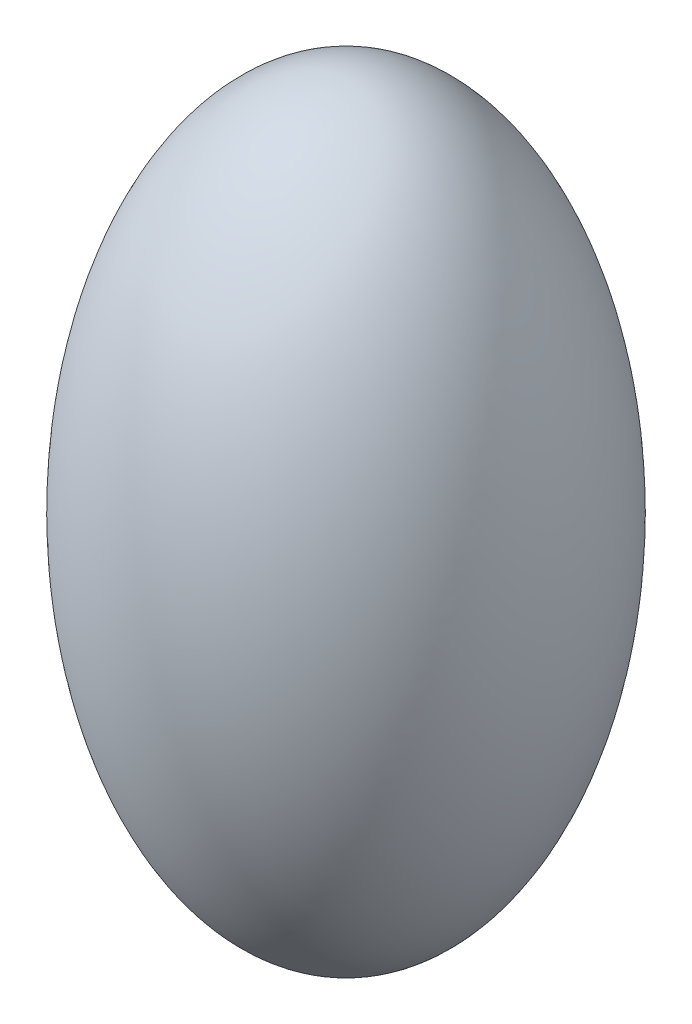
ISO-10303-21;
HEADER;
FILE_DESCRIPTION(('STEP AP214'),'2;1');
FILE_NAME('part.step','',(''),(''),'','','');
FILE_SCHEMA(('AUTOMOTIVE_DESIGN { 1 0 10303 214 1 1 1 1 }'));
ENDSEC;
DATA;
#1=APPLICATION_CONTEXT('core data for automotive mechanical design processes');
#2=APPLICATION_PROTOCOL_DEFINITION('international standard','automotive_design',2000,#1);
#3=PRODUCT_CONTEXT('',#1,'mechanical');
#4=PRODUCT('Part','Part','',(#3));
#5=PRODUCT_RELATED_PRODUCT_CATEGORY('part','',(#4));
#6=PRODUCT_DEFINITION_FORMATION('','',#4);
#7=PRODUCT_DEFINITION_CONTEXT('part definition',#1,'design');
#8=PRODUCT_DEFINITION('design','',#6,#7);
#9=PRODUCT_DEFINITION_SHAPE('','',#8);
#10=(LENGTH_UNIT() NAMED_UNIT(*) SI_UNIT(.MILLI.,.METRE.));
#11=(NAMED_UNIT(*) PLANE_ANGLE_UNIT() SI_UNIT($,.RADIAN.));
#12=(NAMED_UNIT(*) SI_UNIT($,.STERADIAN.) SOLID_ANGLE_UNIT());
#13=UNCERTAINTY_MEASURE_WITH_UNIT(LENGTH_MEASURE(1.E-05),#10,'distance_accuracy_value','');
#14=(GEOMETRIC_REPRESENTATION_CONTEXT(3) GLOBAL_UNCERTAINTY_ASSIGNED_CONTEXT((#13)) GLOBAL_UNIT_ASSIGNED_CONTEXT((#10,
#11,#12)) REPRESENTATION_CONTEXT('',''));
#15=CARTESIAN_POINT('',(0.,0.,0.));
#16=DIRECTION('',(0.,0.,1.));
#17=DIRECTION('',(1.,0.,0.));
#18=AXIS2_PLACEMENT_3D('',#15,#16,#17);
#19=CARTESIAN_POINT('',(0.,0.,0.));
#20=DIRECTION('',(1.,0.,0.));
#21=DIRECTION('',(0.,1.,0.));
#22=AXIS2_PLACEMENT_3D('',#19,#20,#21);
#23=ELLIPSE('',#22,30.1713705861949,17.0345537280909);
#24=TRIMMED_CURVE('',#23,(PARAMETER_VALUE(3.14159265358979)),
(PARAMETER_VALUE(6.28318530717959)),.T.,.PARAMETER.);
#25=CARTESIAN_POINT('',(0.,30.1713705861949,0.));
#26=DIRECTION('',(0.,1.,0.));
#27=AXIS1_PLACEMENT('',#25,#26);
#28=SURFACE_OF_REVOLUTION('',#24,#27);
#29=CARTESIAN_POINT('',(0.,30.1713705861949,0.));
#30=VERTEX_POINT('',#29);
#31=VERTEX_LOOP('',#30);
#32=FACE_BOUND('',#31,.T.);
#33=CARTESIAN_POINT('',(0.,-30.1713705861949,0.));
#34=VERTEX_POINT('',#33);
#35=VERTEX_LOOP('',#34);
#36=FACE_BOUND('',#35,.T.);
#37=ADVANCED_FACE('F36',(#32,#36),#28,.T.);
#38=CLOSED_SHELL('',(#37));
#39=MANIFOLD_SOLID_BREP('B2',#38);
#40=ADVANCED_BREP_SHAPE_REPRESENTATION('',(#18,#39),#14);
#41=SHAPE_DEFINITION_REPRESENTATION(#9,#40);
ENDSEC;
END-ISO-10303-21;
